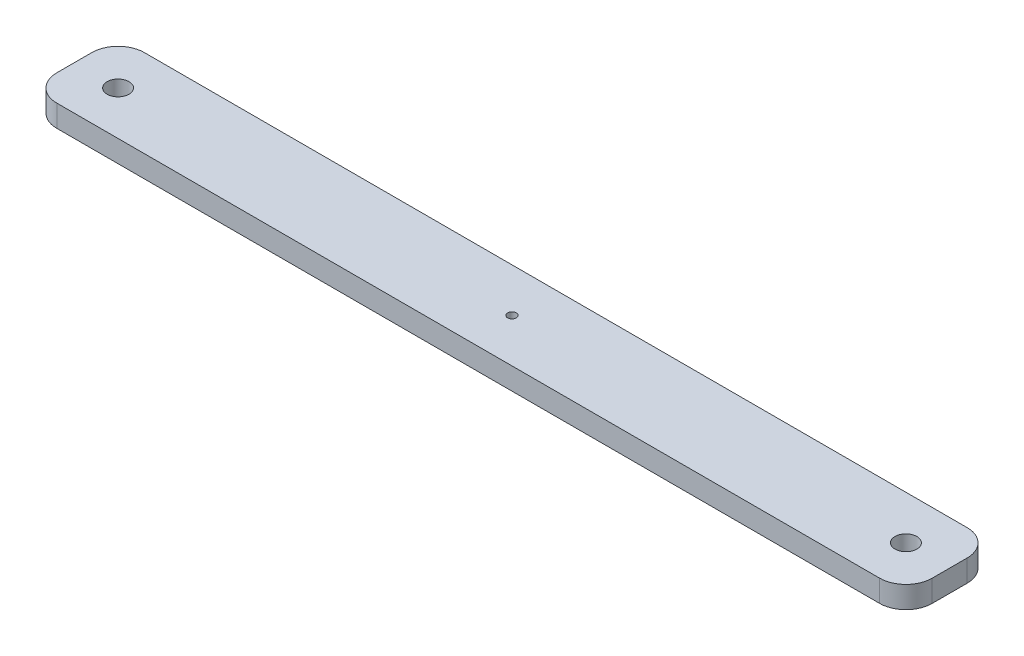
ISO-10303-21;
HEADER;
FILE_DESCRIPTION(('STEP AP214'),'2;1');
FILE_NAME('part.step','',(''),(''),'','','');
FILE_SCHEMA(('AUTOMOTIVE_DESIGN { 1 0 10303 214 1 1 1 1 }'));
ENDSEC;
DATA;
#1=APPLICATION_CONTEXT('core data for automotive mechanical design processes');
#2=APPLICATION_PROTOCOL_DEFINITION('international standard','automotive_design',2000,#1);
#3=PRODUCT_CONTEXT('',#1,'mechanical');
#4=PRODUCT('Part','Part','',(#3));
#5=PRODUCT_RELATED_PRODUCT_CATEGORY('part','',(#4));
#6=PRODUCT_DEFINITION_FORMATION('','',#4);
#7=PRODUCT_DEFINITION_CONTEXT('part definition',#1,'design');
#8=PRODUCT_DEFINITION('design','',#6,#7);
#9=PRODUCT_DEFINITION_SHAPE('','',#8);
#10=(LENGTH_UNIT() NAMED_UNIT(*) SI_UNIT(.MILLI.,.METRE.));
#11=(NAMED_UNIT(*) PLANE_ANGLE_UNIT() SI_UNIT($,.RADIAN.));
#12=(NAMED_UNIT(*) SI_UNIT($,.STERADIAN.) SOLID_ANGLE_UNIT());
#13=UNCERTAINTY_MEASURE_WITH_UNIT(LENGTH_MEASURE(1.E-05),#10,'distance_accuracy_value','');
#14=(GEOMETRIC_REPRESENTATION_CONTEXT(3) GLOBAL_UNCERTAINTY_ASSIGNED_CONTEXT((#13)) GLOBAL_UNIT_ASSIGNED_CONTEXT((#10,
#11,#12)) REPRESENTATION_CONTEXT('',''));
#15=CARTESIAN_POINT('',(0.,0.,0.));
#16=DIRECTION('',(0.,0.,1.));
#17=DIRECTION('',(1.,0.,0.));
#18=AXIS2_PLACEMENT_3D('',#15,#16,#17);
#19=CARTESIAN_POINT('',(246.38,6.35,7.62));
#20=DIRECTION('',(0.,1.,0.));
#21=DIRECTION('',(0.,0.,1.));
#22=AXIS2_PLACEMENT_3D('',#19,#20,#21);
#23=PLANE('',#22);
#24=CARTESIAN_POINT('',(127.,6.35,12.7));
#25=DIRECTION('',(0.,1.,0.));
#26=DIRECTION('',(0.,0.,1.));
#27=AXIS2_PLACEMENT_3D('',#24,#25,#26);
#28=CIRCLE('',#27,1.27);
#29=CARTESIAN_POINT('',(127.,6.35,13.97));
#30=VERTEX_POINT('',#29);
#31=EDGE_CURVE('E213',#30,#30,#28,.T.);
#32=ORIENTED_EDGE('',*,*,#31,.F.);
#33=EDGE_LOOP('',(#32));
#34=FACE_BOUND('',#33,.T.);
#35=CARTESIAN_POINT('',(246.38,6.35,7.62));
#36=DIRECTION('',(0.,1.,0.));
#37=DIRECTION('',(0.,0.,1.));
#38=AXIS2_PLACEMENT_3D('',#35,#36,#37);
#39=CIRCLE('',#38,7.61999999999999);
#40=CARTESIAN_POINT('',(254.,6.35,7.62000000000005));
#41=VERTEX_POINT('',#40);
#42=CARTESIAN_POINT('',(246.38,6.35,0.));
#43=VERTEX_POINT('',#42);
#44=EDGE_CURVE('E164',#41,#43,#39,.T.);
#45=ORIENTED_EDGE('',*,*,#44,.T.);
#46=DIRECTION('',(-1.,0.,0.));
#47=VECTOR('',#46,1.);
#48=CARTESIAN_POINT('',(7.62000000000005,6.35,0.));
#49=LINE('',#48,#47);
#50=CARTESIAN_POINT('',(7.62000000000005,6.35,0.));
#51=VERTEX_POINT('',#50);
#52=EDGE_CURVE('E100',#43,#51,#49,.T.);
#53=ORIENTED_EDGE('',*,*,#52,.T.);
#54=CARTESIAN_POINT('',(7.62,6.35,7.62));
#55=DIRECTION('',(0.,1.,0.));
#56=DIRECTION('',(0.,0.,1.));
#57=AXIS2_PLACEMENT_3D('',#54,#55,#56);
#58=CIRCLE('',#57,7.62);
#59=CARTESIAN_POINT('',(0.,6.35,7.62000000000005));
#60=VERTEX_POINT('',#59);
#61=EDGE_CURVE('E185',#51,#60,#58,.T.);
#62=ORIENTED_EDGE('',*,*,#61,.T.);
#63=DIRECTION('',(0.,0.,1.));
#64=VECTOR('',#63,1.);
#65=CARTESIAN_POINT('',(0.,6.35,7.62000000000005));
#66=LINE('',#65,#64);
#67=CARTESIAN_POINT('',(0.,6.35,17.7799999999999));
#68=VERTEX_POINT('',#67);
#69=EDGE_CURVE('E199',#60,#68,#66,.T.);
#70=ORIENTED_EDGE('',*,*,#69,.T.);
#71=CARTESIAN_POINT('',(7.62,6.35,17.78));
#72=DIRECTION('',(0.,1.,0.));
#73=DIRECTION('',(0.,0.,1.));
#74=AXIS2_PLACEMENT_3D('',#71,#72,#73);
#75=CIRCLE('',#74,7.62);
#76=CARTESIAN_POINT('',(7.62000000000005,6.35,25.4));
#77=VERTEX_POINT('',#76);
#78=EDGE_CURVE('E119',#68,#77,#75,.T.);
#79=ORIENTED_EDGE('',*,*,#78,.T.);
#80=DIRECTION('',(1.,0.,0.));
#81=VECTOR('',#80,1.);
#82=CARTESIAN_POINT('',(7.62000000000005,6.35,25.4));
#83=LINE('',#82,#81);
#84=CARTESIAN_POINT('',(246.38,6.35,25.4));
#85=VERTEX_POINT('',#84);
#86=EDGE_CURVE('E113',#77,#85,#83,.T.);
#87=ORIENTED_EDGE('',*,*,#86,.T.);
#88=CARTESIAN_POINT('',(246.38,6.35,17.78));
#89=DIRECTION('',(0.,1.,0.));
#90=DIRECTION('',(0.,0.,-1.));
#91=AXIS2_PLACEMENT_3D('',#88,#89,#90);
#92=CIRCLE('',#91,7.61999999999999);
#93=CARTESIAN_POINT('',(254.,6.35,17.7799999999999));
#94=VERTEX_POINT('',#93);
#95=EDGE_CURVE('E117',#85,#94,#92,.T.);
#96=ORIENTED_EDGE('',*,*,#95,.T.);
#97=DIRECTION('',(0.,0.,-1.));
#98=VECTOR('',#97,1.);
#99=CARTESIAN_POINT('',(254.,6.35,7.62000000000005));
#100=LINE('',#99,#98);
#101=EDGE_CURVE('E57',#94,#41,#100,.T.);
#102=ORIENTED_EDGE('',*,*,#101,.T.);
#103=EDGE_LOOP('',(#45,#53,#62,#70,#79,#87,#96,#102));
#104=FACE_BOUND('',#103,.T.);
#105=CARTESIAN_POINT('',(12.7,6.35,12.7));
#106=DIRECTION('',(0.,1.,0.));
#107=DIRECTION('',(0.,0.,1.));
#108=AXIS2_PLACEMENT_3D('',#105,#106,#107);
#109=CIRCLE('',#108,3.175);
#110=CARTESIAN_POINT('',(12.7,6.35,15.875));
#111=VERTEX_POINT('',#110);
#112=EDGE_CURVE('E146',#111,#111,#109,.T.);
#113=ORIENTED_EDGE('',*,*,#112,.F.);
#114=EDGE_LOOP('',(#113));
#115=FACE_BOUND('',#114,.T.);
#116=CARTESIAN_POINT('',(241.3,6.35,12.7));
#117=DIRECTION('',(0.,1.,0.));
#118=DIRECTION('',(0.,0.,-1.));
#119=AXIS2_PLACEMENT_3D('',#116,#117,#118);
#120=CIRCLE('',#119,3.175);
#121=CARTESIAN_POINT('',(241.3,6.35,9.525));
#122=VERTEX_POINT('',#121);
#123=EDGE_CURVE('E221',#122,#122,#120,.T.);
#124=ORIENTED_EDGE('',*,*,#123,.F.);
#125=EDGE_LOOP('',(#124));
#126=FACE_BOUND('',#125,.T.);
#127=ADVANCED_FACE('F39',(#34,#104,#115,#126),#23,.T.);
#128=CARTESIAN_POINT('',(246.38,0.,7.62));
#129=DIRECTION('',(0.,1.,0.));
#130=DIRECTION('',(0.,0.,1.));
#131=AXIS2_PLACEMENT_3D('',#128,#129,#130);
#132=PLANE('',#131);
#133=CARTESIAN_POINT('',(246.38,0.,7.62));
#134=DIRECTION('',(0.,1.,0.));
#135=DIRECTION('',(0.,0.,1.));
#136=AXIS2_PLACEMENT_3D('',#133,#134,#135);
#137=CIRCLE('',#136,7.61999999999999);
#138=CARTESIAN_POINT('',(254.,0.,7.62000000000005));
#139=VERTEX_POINT('',#138);
#140=CARTESIAN_POINT('',(246.38,0.,0.));
#141=VERTEX_POINT('',#140);
#142=EDGE_CURVE('E141',#139,#141,#137,.T.);
#143=ORIENTED_EDGE('',*,*,#142,.F.);
#144=DIRECTION('',(0.,0.,-1.));
#145=VECTOR('',#144,1.);
#146=CARTESIAN_POINT('',(254.,0.,7.62000000000005));
#147=LINE('',#146,#145);
#148=CARTESIAN_POINT('',(254.,0.,17.7799999999999));
#149=VERTEX_POINT('',#148);
#150=EDGE_CURVE('E92',#149,#139,#147,.T.);
#151=ORIENTED_EDGE('',*,*,#150,.F.);
#152=CARTESIAN_POINT('',(246.38,0.,17.78));
#153=DIRECTION('',(0.,1.,0.));
#154=DIRECTION('',(0.,0.,-1.));
#155=AXIS2_PLACEMENT_3D('',#152,#153,#154);
#156=CIRCLE('',#155,7.61999999999999);
#157=CARTESIAN_POINT('',(246.38,0.,25.4));
#158=VERTEX_POINT('',#157);
#159=EDGE_CURVE('E86',#158,#149,#156,.T.);
#160=ORIENTED_EDGE('',*,*,#159,.F.);
#161=DIRECTION('',(1.,0.,0.));
#162=VECTOR('',#161,1.);
#163=CARTESIAN_POINT('',(7.62000000000005,0.,25.4));
#164=LINE('',#163,#162);
#165=CARTESIAN_POINT('',(7.62000000000005,0.,25.4));
#166=VERTEX_POINT('',#165);
#167=EDGE_CURVE('E128',#166,#158,#164,.T.);
#168=ORIENTED_EDGE('',*,*,#167,.F.);
#169=CARTESIAN_POINT('',(7.62,0.,17.78));
#170=DIRECTION('',(0.,1.,0.));
#171=DIRECTION('',(0.,0.,1.));
#172=AXIS2_PLACEMENT_3D('',#169,#170,#171);
#173=CIRCLE('',#172,7.62);
#174=CARTESIAN_POINT('',(0.,0.,17.7799999999999));
#175=VERTEX_POINT('',#174);
#176=EDGE_CURVE('E155',#175,#166,#173,.T.);
#177=ORIENTED_EDGE('',*,*,#176,.F.);
#178=DIRECTION('',(0.,0.,1.));
#179=VECTOR('',#178,1.);
#180=CARTESIAN_POINT('',(0.,0.,7.62000000000005));
#181=LINE('',#180,#179);
#182=CARTESIAN_POINT('',(0.,0.,7.62000000000005));
#183=VERTEX_POINT('',#182);
#184=EDGE_CURVE('E152',#183,#175,#181,.T.);
#185=ORIENTED_EDGE('',*,*,#184,.F.);
#186=CARTESIAN_POINT('',(7.62,0.,7.62));
#187=DIRECTION('',(0.,1.,0.));
#188=DIRECTION('',(0.,0.,1.));
#189=AXIS2_PLACEMENT_3D('',#186,#187,#188);
#190=CIRCLE('',#189,7.62);
#191=CARTESIAN_POINT('',(7.62000000000005,0.,0.));
#192=VERTEX_POINT('',#191);
#193=EDGE_CURVE('E149',#192,#183,#190,.T.);
#194=ORIENTED_EDGE('',*,*,#193,.F.);
#195=DIRECTION('',(-1.,0.,0.));
#196=VECTOR('',#195,1.);
#197=CARTESIAN_POINT('',(7.62000000000005,0.,0.));
#198=LINE('',#197,#196);
#199=EDGE_CURVE('E145',#141,#192,#198,.T.);
#200=ORIENTED_EDGE('',*,*,#199,.F.);
#201=EDGE_LOOP('',(#143,#151,#160,#168,#177,#185,#194,#200));
#202=FACE_BOUND('',#201,.T.);
#203=CARTESIAN_POINT('',(12.7,0.,12.7));
#204=DIRECTION('',(0.,1.,0.));
#205=DIRECTION('',(0.,0.,1.));
#206=AXIS2_PLACEMENT_3D('',#203,#204,#205);
#207=CIRCLE('',#206,3.175);
#208=CARTESIAN_POINT('',(12.7,0.,15.875));
#209=VERTEX_POINT('',#208);
#210=EDGE_CURVE('E209',#209,#209,#207,.T.);
#211=ORIENTED_EDGE('',*,*,#210,.T.);
#212=EDGE_LOOP('',(#211));
#213=FACE_BOUND('',#212,.T.);
#214=CARTESIAN_POINT('',(127.,0.,12.7));
#215=DIRECTION('',(0.,1.,0.));
#216=DIRECTION('',(0.,0.,1.));
#217=AXIS2_PLACEMENT_3D('',#214,#215,#216);
#218=CIRCLE('',#217,1.27);
#219=CARTESIAN_POINT('',(127.,0.,13.97));
#220=VERTEX_POINT('',#219);
#221=EDGE_CURVE('E217',#220,#220,#218,.T.);
#222=ORIENTED_EDGE('',*,*,#221,.T.);
#223=EDGE_LOOP('',(#222));
#224=FACE_BOUND('',#223,.T.);
#225=CARTESIAN_POINT('',(241.3,0.,12.7));
#226=DIRECTION('',(0.,1.,0.));
#227=DIRECTION('',(0.,0.,-1.));
#228=AXIS2_PLACEMENT_3D('',#225,#226,#227);
#229=CIRCLE('',#228,3.175);
#230=CARTESIAN_POINT('',(241.3,0.,9.525));
#231=VERTEX_POINT('',#230);
#232=EDGE_CURVE('E225',#231,#231,#229,.T.);
#233=ORIENTED_EDGE('',*,*,#232,.T.);
#234=EDGE_LOOP('',(#233));
#235=FACE_BOUND('',#234,.T.);
#236=ADVANCED_FACE('F189',(#202,#213,#224,#235),#132,.F.);
#237=CARTESIAN_POINT('',(246.38,6.35,7.62));
#238=DIRECTION('',(0.,-1.,0.));
#239=DIRECTION('',(0.,0.,-1.));
#240=AXIS2_PLACEMENT_3D('',#237,#238,#239);
#241=CYLINDRICAL_SURFACE('',#240,7.61999999999999);
#242=ORIENTED_EDGE('',*,*,#142,.T.);
#243=DIRECTION('',(0.,-1.,0.));
#244=VECTOR('',#243,1.);
#245=CARTESIAN_POINT('',(246.38,6.35,0.));
#246=LINE('',#245,#244);
#247=EDGE_CURVE('E11',#43,#141,#246,.T.);
#248=ORIENTED_EDGE('',*,*,#247,.F.);
#249=ORIENTED_EDGE('',*,*,#44,.F.);
#250=DIRECTION('',(0.,-1.,0.));
#251=VECTOR('',#250,1.);
#252=CARTESIAN_POINT('',(254.,6.35,7.62000000000005));
#253=LINE('',#252,#251);
#254=EDGE_CURVE('E137',#41,#139,#253,.T.);
#255=ORIENTED_EDGE('',*,*,#254,.T.);
#256=EDGE_LOOP('',(#242,#248,#249,#255));
#257=FACE_BOUND('',#256,.T.);
#258=ADVANCED_FACE('F41',(#257),#241,.T.);
#259=CARTESIAN_POINT('',(7.62000000000005,6.35,0.));
#260=DIRECTION('',(0.,0.,1.));
#261=DIRECTION('',(1.,0.,0.));
#262=AXIS2_PLACEMENT_3D('',#259,#260,#261);
#263=PLANE('',#262);
#264=ORIENTED_EDGE('',*,*,#199,.T.);
#265=DIRECTION('',(0.,-1.,0.));
#266=VECTOR('',#265,1.);
#267=CARTESIAN_POINT('',(7.62000000000005,6.35,0.));
#268=LINE('',#267,#266);
#269=EDGE_CURVE('E49',#51,#192,#268,.T.);
#270=ORIENTED_EDGE('',*,*,#269,.F.);
#271=ORIENTED_EDGE('',*,*,#52,.F.);
#272=ORIENTED_EDGE('',*,*,#247,.T.);
#273=EDGE_LOOP('',(#264,#270,#271,#272));
#274=FACE_BOUND('',#273,.T.);
#275=ADVANCED_FACE('F260',(#274),#263,.F.);
#276=CARTESIAN_POINT('',(7.62,6.35,7.62));
#277=DIRECTION('',(0.,-1.,0.));
#278=DIRECTION('',(0.,0.,-1.));
#279=AXIS2_PLACEMENT_3D('',#276,#277,#278);
#280=CYLINDRICAL_SURFACE('',#279,7.62);
#281=ORIENTED_EDGE('',*,*,#193,.T.);
#282=DIRECTION('',(0.,-1.,0.));
#283=VECTOR('',#282,1.);
#284=CARTESIAN_POINT('',(0.,6.35,7.62000000000005));
#285=LINE('',#284,#283);
#286=EDGE_CURVE('E175',#60,#183,#285,.T.);
#287=ORIENTED_EDGE('',*,*,#286,.F.);
#288=ORIENTED_EDGE('',*,*,#61,.F.);
#289=ORIENTED_EDGE('',*,*,#269,.T.);
#290=EDGE_LOOP('',(#281,#287,#288,#289));
#291=FACE_BOUND('',#290,.T.);
#292=ADVANCED_FACE('F183',(#291),#280,.T.);
#293=CARTESIAN_POINT('',(0.,6.35,7.62000000000005));
#294=DIRECTION('',(1.,0.,0.));
#295=DIRECTION('',(0.,0.,-1.));
#296=AXIS2_PLACEMENT_3D('',#293,#294,#295);
#297=PLANE('',#296);
#298=ORIENTED_EDGE('',*,*,#184,.T.);
#299=DIRECTION('',(0.,-1.,0.));
#300=VECTOR('',#299,1.);
#301=CARTESIAN_POINT('',(0.,6.35,17.7799999999999));
#302=LINE('',#301,#300);
#303=EDGE_CURVE('E171',#68,#175,#302,.T.);
#304=ORIENTED_EDGE('',*,*,#303,.F.);
#305=ORIENTED_EDGE('',*,*,#69,.F.);
#306=ORIENTED_EDGE('',*,*,#286,.T.);
#307=EDGE_LOOP('',(#298,#304,#305,#306));
#308=FACE_BOUND('',#307,.T.);
#309=ADVANCED_FACE('F194',(#308),#297,.F.);
#310=CARTESIAN_POINT('',(7.62,6.35,17.78));
#311=DIRECTION('',(0.,-1.,0.));
#312=DIRECTION('',(0.,0.,-1.));
#313=AXIS2_PLACEMENT_3D('',#310,#311,#312);
#314=CYLINDRICAL_SURFACE('',#313,7.62);
#315=ORIENTED_EDGE('',*,*,#176,.T.);
#316=DIRECTION('',(0.,-1.,0.));
#317=VECTOR('',#316,1.);
#318=CARTESIAN_POINT('',(7.62000000000005,6.35,25.4));
#319=LINE('',#318,#317);
#320=EDGE_CURVE('E130',#77,#166,#319,.T.);
#321=ORIENTED_EDGE('',*,*,#320,.F.);
#322=ORIENTED_EDGE('',*,*,#78,.F.);
#323=ORIENTED_EDGE('',*,*,#303,.T.);
#324=EDGE_LOOP('',(#315,#321,#322,#323));
#325=FACE_BOUND('',#324,.T.);
#326=ADVANCED_FACE('F197',(#325),#314,.T.);
#327=CARTESIAN_POINT('',(7.62000000000005,6.35,25.4));
#328=DIRECTION('',(0.,0.,-1.));
#329=DIRECTION('',(-1.,0.,0.));
#330=AXIS2_PLACEMENT_3D('',#327,#328,#329);
#331=PLANE('',#330);
#332=ORIENTED_EDGE('',*,*,#167,.T.);
#333=DIRECTION('',(0.,-1.,0.));
#334=VECTOR('',#333,1.);
#335=CARTESIAN_POINT('',(246.38,6.35,25.4));
#336=LINE('',#335,#334);
#337=EDGE_CURVE('E125',#85,#158,#336,.T.);
#338=ORIENTED_EDGE('',*,*,#337,.F.);
#339=ORIENTED_EDGE('',*,*,#86,.F.);
#340=ORIENTED_EDGE('',*,*,#320,.T.);
#341=EDGE_LOOP('',(#332,#338,#339,#340));
#342=FACE_BOUND('',#341,.T.);
#343=ADVANCED_FACE('F126',(#342),#331,.F.);
#344=CARTESIAN_POINT('',(246.38,6.35,17.78));
#345=DIRECTION('',(0.,-1.,0.));
#346=DIRECTION('',(0.,0.,-1.));
#347=AXIS2_PLACEMENT_3D('',#344,#345,#346);
#348=CYLINDRICAL_SURFACE('',#347,7.61999999999999);
#349=ORIENTED_EDGE('',*,*,#159,.T.);
#350=DIRECTION('',(0.,-1.,0.));
#351=VECTOR('',#350,1.);
#352=CARTESIAN_POINT('',(254.,6.35,17.7799999999999));
#353=LINE('',#352,#351);
#354=EDGE_CURVE('E131',#94,#149,#353,.T.);
#355=ORIENTED_EDGE('',*,*,#354,.F.);
#356=ORIENTED_EDGE('',*,*,#95,.F.);
#357=ORIENTED_EDGE('',*,*,#337,.T.);
#358=EDGE_LOOP('',(#349,#355,#356,#357));
#359=FACE_BOUND('',#358,.T.);
#360=ADVANCED_FACE('F133',(#359),#348,.T.);
#361=CARTESIAN_POINT('',(254.,6.35,7.62000000000005));
#362=DIRECTION('',(-1.,0.,0.));
#363=DIRECTION('',(0.,0.,1.));
#364=AXIS2_PLACEMENT_3D('',#361,#362,#363);
#365=PLANE('',#364);
#366=ORIENTED_EDGE('',*,*,#150,.T.);
#367=ORIENTED_EDGE('',*,*,#254,.F.);
#368=ORIENTED_EDGE('',*,*,#101,.F.);
#369=ORIENTED_EDGE('',*,*,#354,.T.);
#370=EDGE_LOOP('',(#366,#367,#368,#369));
#371=FACE_BOUND('',#370,.T.);
#372=ADVANCED_FACE('F248',(#371),#365,.F.);
#373=CARTESIAN_POINT('',(12.7,6.35,12.7));
#374=DIRECTION('',(0.,-1.,0.));
#375=DIRECTION('',(0.,0.,-1.));
#376=AXIS2_PLACEMENT_3D('',#373,#374,#375);
#377=CYLINDRICAL_SURFACE('',#376,3.175);
#378=ORIENTED_EDGE('',*,*,#112,.T.);
#379=EDGE_LOOP('',(#378));
#380=FACE_BOUND('',#379,.T.);
#381=ORIENTED_EDGE('',*,*,#210,.F.);
#382=EDGE_LOOP('',(#381));
#383=FACE_BOUND('',#382,.T.);
#384=ADVANCED_FACE('F245',(#380,#383),#377,.F.);
#385=CARTESIAN_POINT('',(127.,6.35,12.7));
#386=DIRECTION('',(0.,-1.,0.));
#387=DIRECTION('',(0.,0.,-1.));
#388=AXIS2_PLACEMENT_3D('',#385,#386,#387);
#389=CYLINDRICAL_SURFACE('',#388,1.27);
#390=ORIENTED_EDGE('',*,*,#31,.T.);
#391=EDGE_LOOP('',(#390));
#392=FACE_BOUND('',#391,.T.);
#393=ORIENTED_EDGE('',*,*,#221,.F.);
#394=EDGE_LOOP('',(#393));
#395=FACE_BOUND('',#394,.T.);
#396=ADVANCED_FACE('F324',(#392,#395),#389,.F.);
#397=CARTESIAN_POINT('',(241.3,6.35,12.7));
#398=DIRECTION('',(0.,-1.,0.));
#399=DIRECTION('',(0.,0.,-1.));
#400=AXIS2_PLACEMENT_3D('',#397,#398,#399);
#401=CYLINDRICAL_SURFACE('',#400,3.175);
#402=ORIENTED_EDGE('',*,*,#123,.T.);
#403=EDGE_LOOP('',(#402));
#404=FACE_BOUND('',#403,.T.);
#405=ORIENTED_EDGE('',*,*,#232,.F.);
#406=EDGE_LOOP('',(#405));
#407=FACE_BOUND('',#406,.T.);
#408=ADVANCED_FACE('F233',(#404,#407),#401,.F.);
#409=CLOSED_SHELL('',(#127,#236,#258,#275,#292,#309,#326,#343,#360,#372,#384,#396,#408));
#410=MANIFOLD_SOLID_BREP('B2',#409);
#411=ADVANCED_BREP_SHAPE_REPRESENTATION('',(#18,#410),#14);
#412=SHAPE_DEFINITION_REPRESENTATION(#9,#411);
ENDSEC;
END-ISO-10303-21;
